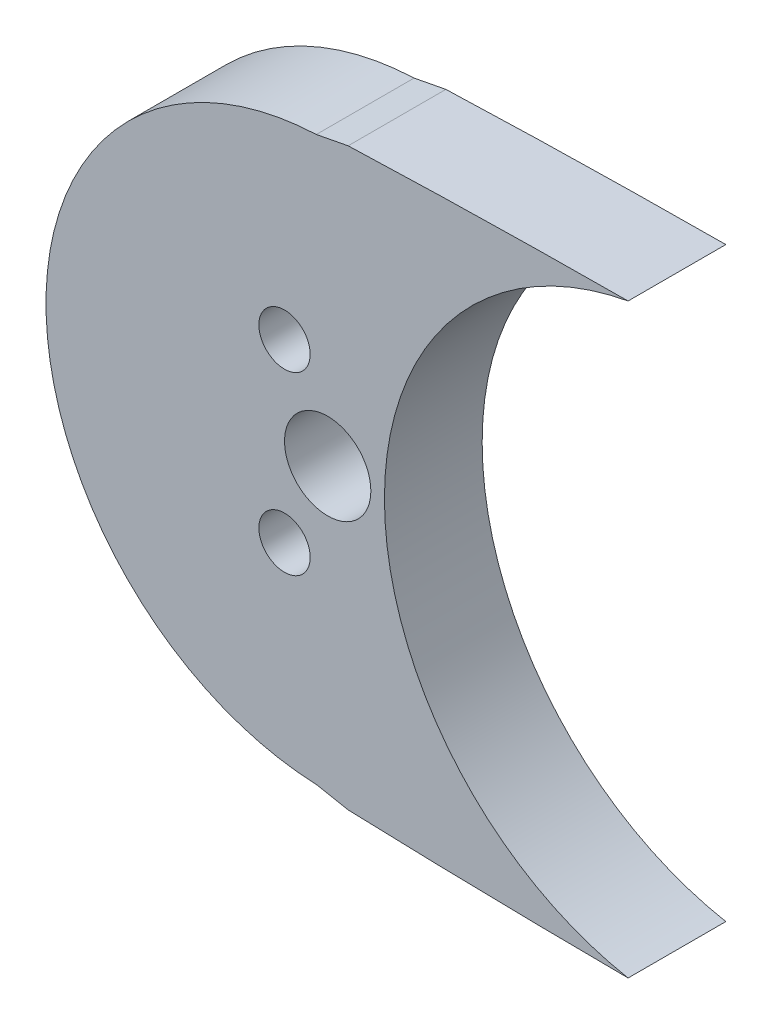
ISO-10303-21;
HEADER;
FILE_DESCRIPTION(('STEP AP214'),'2;1');
FILE_NAME('part.step','',(''),(''),'','','');
FILE_SCHEMA(('AUTOMOTIVE_DESIGN { 1 0 10303 214 1 1 1 1 }'));
ENDSEC;
DATA;
#1=APPLICATION_CONTEXT('core data for automotive mechanical design processes');
#2=APPLICATION_PROTOCOL_DEFINITION('international standard','automotive_design',2000,#1);
#3=PRODUCT_CONTEXT('',#1,'mechanical');
#4=PRODUCT('Part','Part','',(#3));
#5=PRODUCT_RELATED_PRODUCT_CATEGORY('part','',(#4));
#6=PRODUCT_DEFINITION_FORMATION('','',#4);
#7=PRODUCT_DEFINITION_CONTEXT('part definition',#1,'design');
#8=PRODUCT_DEFINITION('design','',#6,#7);
#9=PRODUCT_DEFINITION_SHAPE('','',#8);
#10=(LENGTH_UNIT() NAMED_UNIT(*) SI_UNIT(.MILLI.,.METRE.));
#11=(NAMED_UNIT(*) PLANE_ANGLE_UNIT() SI_UNIT($,.RADIAN.));
#12=(NAMED_UNIT(*) SI_UNIT($,.STERADIAN.) SOLID_ANGLE_UNIT());
#13=UNCERTAINTY_MEASURE_WITH_UNIT(LENGTH_MEASURE(1.E-05),#10,'distance_accuracy_value','');
#14=(GEOMETRIC_REPRESENTATION_CONTEXT(3) GLOBAL_UNCERTAINTY_ASSIGNED_CONTEXT((#13)) GLOBAL_UNIT_ASSIGNED_CONTEXT((#10,
#11,#12)) REPRESENTATION_CONTEXT('',''));
#15=CARTESIAN_POINT('',(0.,0.,0.));
#16=DIRECTION('',(0.,0.,1.));
#17=DIRECTION('',(1.,0.,0.));
#18=AXIS2_PLACEMENT_3D('',#15,#16,#17);
#19=CARTESIAN_POINT('',(300.,0.378,10.25));
#20=CARTESIAN_POINT('',(299.845901447221,0.39961034336831,10.25));
#21=CARTESIAN_POINT('',(299.230346714046,0.48593399083917,10.25));
#22=CARTESIAN_POINT('',(297.848901683276,0.678531057447331,10.25));
#23=CARTESIAN_POINT('',(295.556029122455,0.996787499241564,10.25));
#24=CARTESIAN_POINT('',(292.365739581197,1.43343203295321,10.25));
#25=CARTESIAN_POINT('',(288.297856433401,1.98344889126347,10.25));
#26=CARTESIAN_POINT('',(283.377248038078,2.63572648359042,10.25));
#27=CARTESIAN_POINT('',(277.63430498472,3.38149178862329,10.25));
#28=CARTESIAN_POINT('',(271.104515413466,4.20901604095742,10.25));
#29=CARTESIAN_POINT('',(263.828064626846,5.10718872872647,10.25));
#30=CARTESIAN_POINT('',(255.849823781818,6.06276893212352,10.25));
#31=CARTESIAN_POINT('',(247.21903434379,7.06424307195608,10.25));
#32=CARTESIAN_POINT('',(237.988783489903,8.09787318806774,10.25));
#33=CARTESIAN_POINT('',(228.216029511608,9.15107036010328,10.25));
#34=CARTESIAN_POINT('',(217.961088379031,10.2107446574668,10.25));
#35=CARTESIAN_POINT('',(207.287161839572,11.2632209265187,10.25));
#36=CARTESIAN_POINT('',(196.260086850424,12.2937248064858,10.25));
#37=CARTESIAN_POINT('',(184.947773044503,13.2887281219597,10.25));
#38=CARTESIAN_POINT('',(173.420088229148,14.2315961384787,10.25));
#39=CARTESIAN_POINT('',(161.747864995533,15.1069553720124,10.25));
#40=CARTESIAN_POINT('',(150.00317252135,15.8985540753976,10.25));
#41=CARTESIAN_POINT('',(138.258374542497,16.5898406039741,10.25));
#42=CARTESIAN_POINT('',(126.585774705795,17.1633504747405,10.25));
#43=CARTESIAN_POINT('',(115.057462615139,17.6037905135667,10.25));
#44=CARTESIAN_POINT('',(103.744181572864,17.8967919128621,10.25));
#45=CARTESIAN_POINT('',(92.7158453472272,18.0280433746414,10.25));
#46=CARTESIAN_POINT('',(82.0402185013839,17.9871287273908,10.25));
#47=CARTESIAN_POINT('',(71.7831190583338,17.7661449762132,10.25));
#48=CARTESIAN_POINT('',(62.0076841473254,17.3594904245971,10.25));
#49=CARTESIAN_POINT('',(52.7740834437817,16.7661013276277,10.25));
#50=CARTESIAN_POINT('',(44.1390669938569,15.987763153894,10.25));
#51=CARTESIAN_POINT('',(36.1554749512941,15.0305547578774,10.25));
#52=CARTESIAN_POINT('',(28.8719698679608,13.9026205663682,10.25));
#53=CARTESIAN_POINT('',(22.3326880228315,12.6157408879695,10.25));
#54=CARTESIAN_POINT('',(16.5759570466198,11.1844668147641,10.25));
#55=CARTESIAN_POINT('',(11.6344891822112,9.62275505380201,10.25));
#56=CARTESIAN_POINT('',(7.53339032845527,7.94515078115887,10.25));
#57=CARTESIAN_POINT('',(4.28573900369485,6.16300377839948,10.25));
#58=CARTESIAN_POINT('',(1.8965325692393,4.27279663699588,10.25));
#59=CARTESIAN_POINT('',(0.366265286449645,2.2288009510305,10.25));
#60=CARTESIAN_POINT('',(-0.170692645797294,0.,10.25));
#61=CARTESIAN_POINT('',(0.366265286449666,-2.22880095103055,10.25));
#62=CARTESIAN_POINT('',(1.89653256923925,-4.27279663699582,10.25));
#63=CARTESIAN_POINT('',(4.28573900369493,-6.16300377839955,10.25));
#64=CARTESIAN_POINT('',(7.53339032845521,-7.94515078115883,10.25));
#65=CARTESIAN_POINT('',(11.6344891822112,-9.62275505380201,10.25));
#66=CARTESIAN_POINT('',(16.5759570466199,-11.1844668147641,10.25));
#67=CARTESIAN_POINT('',(22.3326880228314,-12.6157408879695,10.25));
#68=CARTESIAN_POINT('',(28.8719698679608,-13.9026205663682,10.25));
#69=CARTESIAN_POINT('',(36.155474951294,-15.0305547578773,10.25));
#70=CARTESIAN_POINT('',(44.1390669938569,-15.987763153894,10.25));
#71=CARTESIAN_POINT('',(52.7740834437817,-16.7661013276277,10.25));
#72=CARTESIAN_POINT('',(62.0076841473254,-17.3594904245971,10.25));
#73=CARTESIAN_POINT('',(71.7831190583338,-17.7661449762132,10.25));
#74=CARTESIAN_POINT('',(82.0402185013839,-17.9871287273908,10.25));
#75=CARTESIAN_POINT('',(92.7158453472273,-18.0280433746414,10.25));
#76=CARTESIAN_POINT('',(103.744181572864,-17.8967919128621,10.25));
#77=CARTESIAN_POINT('',(115.057462615139,-17.6037905135667,10.25));
#78=CARTESIAN_POINT('',(126.585774705795,-17.1633504747405,10.25));
#79=CARTESIAN_POINT('',(138.258374542497,-16.5898406039741,10.25));
#80=CARTESIAN_POINT('',(150.00317252135,-15.8985540753976,10.25));
#81=CARTESIAN_POINT('',(161.747864995533,-15.1069553720124,10.25));
#82=CARTESIAN_POINT('',(173.420088229148,-14.2315961384787,10.25));
#83=CARTESIAN_POINT('',(184.947773044503,-13.2887281219597,10.25));
#84=CARTESIAN_POINT('',(196.260086850424,-12.2937248064858,10.25));
#85=CARTESIAN_POINT('',(207.287161839572,-11.2632209265187,10.25));
#86=CARTESIAN_POINT('',(217.961088379031,-10.2107446574668,10.25));
#87=CARTESIAN_POINT('',(228.216029511608,-9.15107036010328,10.25));
#88=CARTESIAN_POINT('',(237.988783489903,-8.09787318806774,10.25));
#89=CARTESIAN_POINT('',(247.21903434379,-7.06424307195608,10.25));
#90=CARTESIAN_POINT('',(255.849823781818,-6.0627689321235,10.25));
#91=CARTESIAN_POINT('',(263.828064626846,-5.10718872872648,10.25));
#92=CARTESIAN_POINT('',(271.104515413466,-4.20901604095741,10.25));
#93=CARTESIAN_POINT('',(277.63430498472,-3.38149178862329,10.25));
#94=CARTESIAN_POINT('',(283.377248038078,-2.63572648359043,10.25));
#95=CARTESIAN_POINT('',(288.297856433401,-1.98344889126346,10.25));
#96=CARTESIAN_POINT('',(292.365739581198,-1.43343203295321,10.25));
#97=CARTESIAN_POINT('',(295.556029122455,-0.996787499241567,10.25));
#98=CARTESIAN_POINT('',(297.848901683276,-0.678531057447318,10.25));
#99=CARTESIAN_POINT('',(299.230346714046,-0.48593399083919,10.25));
#100=CARTESIAN_POINT('',(299.845901447221,-0.399610343368311,10.25));
#101=CARTESIAN_POINT('',(300.,-0.378,10.25));
#102=B_SPLINE_CURVE_WITH_KNOTS('',3,(#19,#20,#21,#22,#23,#24,#25,#26,#27,#28,#29,#30,#31,#32,
#33,#34,#35,#36,#37,#38,#39,#40,#41,#42,#43,#44,#45,#46,#47,#48,#49,#50,#51,#52,#53,#54,#55,#56,
#57,#58,#59,#60,#61,#62,#63,#64,#65,#66,#67,#68,#69,#70,#71,#72,#73,#74,#75,#76,#77,#78,#79,#80,
#81,#82,#83,#84,#85,#86,#87,#88,#89,#90,#91,#92,#93,#94,#95,#96,#97,#98,#99,#100,#101),
.UNSPECIFIED.,.F.,.F.,(4,1,1,1,1,1,1,1,1,1,1,1,1,1,1,1,1,1,1,1,1,1,1,1,1,1,1,1,1,1,1,1,1,1,1,1,
1,1,1,1,1,1,1,1,1,1,1,1,1,1,1,1,1,1,1,1,1,1,1,1,1,1,1,1,1,1,1,1,1,1,1,1,1,1,1,1,1,1,1,1,4),(0.,
0.000763156679271448,0.00304846929193477,0.00684068957953669,0.0121161317605396,
0.0188407924276644,0.0269727495182071,0.0364598537113803,0.0472429445210447,0.0592535547279477,
0.0724172643119224,0.0866510217067198,0.101866322474926,0.117968955401192,0.134857918638583,
0.152428309483259,0.170571841082248,0.189174521814913,0.208122338288737,0.227296649324545,
0.246580070424687,0.265853108019993,0.284996761496293,0.303895241632262,0.322432580929281,
0.340498658943124,0.357984483489282,0.37478811429809,0.390812303248415,0.405965006366899,
0.420162443159487,0.433328264782086,0.445393603392471,0.456301171479378,0.466003880875037,
0.474472000637231,0.481696232103684,0.487703697963338,0.492583405321472,0.496543603187854,0.5,
0.503456396812145,0.507416594678528,0.512296302036662,0.518303767896316,0.525527999362769,
0.533996119124963,0.543698828520622,0.554606396607529,0.566671735217914,0.579837556840513,
0.594034993633101,0.609187696751585,0.62521188570191,0.642015516510718,0.659501341056876,
0.677567419070719,0.696104758367738,0.715003238503707,0.734146891980006,0.753419929575313,
0.772703350675454,0.791877661711263,0.810825478185087,0.829428158917752,0.847571690516741,
0.865142081361417,0.882031044598807,0.898133677525074,0.91334897829328,0.927582735688077,
0.940746445272052,0.952757055478955,0.96354014628862,0.973027250481793,0.981159207572336,
0.98788386823946,0.993159310420463,0.996951530708065,0.999236843320729,1.),.UNSPECIFIED.);
#103=DIRECTION('',(0.,0.,-1.));
#104=VECTOR('',#103,1.);
#105=SURFACE_OF_LINEAR_EXTRUSION('',#102,#104);
#106=CARTESIAN_POINT('',(300.,0.378,4.25));
#107=CARTESIAN_POINT('',(299.845901447221,0.39961034336831,4.25));
#108=CARTESIAN_POINT('',(299.230346714046,0.48593399083917,4.25));
#109=CARTESIAN_POINT('',(297.848901683276,0.678531057447331,4.25));
#110=CARTESIAN_POINT('',(295.556029122455,0.996787499241564,4.25));
#111=CARTESIAN_POINT('',(292.365739581197,1.43343203295321,4.25));
#112=CARTESIAN_POINT('',(288.297856433401,1.98344889126347,4.25));
#113=CARTESIAN_POINT('',(283.377248038078,2.63572648359042,4.25));
#114=CARTESIAN_POINT('',(277.63430498472,3.38149178862329,4.25));
#115=CARTESIAN_POINT('',(271.104515413466,4.20901604095742,4.25));
#116=CARTESIAN_POINT('',(263.828064626846,5.10718872872647,4.25));
#117=CARTESIAN_POINT('',(255.849823781818,6.06276893212352,4.25));
#118=CARTESIAN_POINT('',(247.21903434379,7.06424307195608,4.25));
#119=CARTESIAN_POINT('',(237.988783489903,8.09787318806774,4.25));
#120=CARTESIAN_POINT('',(228.216029511608,9.15107036010328,4.25));
#121=CARTESIAN_POINT('',(217.961088379031,10.2107446574668,4.25));
#122=CARTESIAN_POINT('',(207.287161839572,11.2632209265187,4.25));
#123=CARTESIAN_POINT('',(196.260086850424,12.2937248064858,4.25));
#124=CARTESIAN_POINT('',(184.947773044503,13.2887281219597,4.25));
#125=CARTESIAN_POINT('',(173.420088229148,14.2315961384787,4.25));
#126=CARTESIAN_POINT('',(161.747864995533,15.1069553720124,4.25));
#127=CARTESIAN_POINT('',(150.00317252135,15.8985540753976,4.25));
#128=CARTESIAN_POINT('',(138.258374542497,16.5898406039741,4.25));
#129=CARTESIAN_POINT('',(126.585774705795,17.1633504747405,4.25));
#130=CARTESIAN_POINT('',(115.057462615139,17.6037905135667,4.25));
#131=CARTESIAN_POINT('',(103.744181572864,17.8967919128621,4.25));
#132=CARTESIAN_POINT('',(92.7158453472272,18.0280433746414,4.25));
#133=CARTESIAN_POINT('',(82.0402185013839,17.9871287273908,4.25));
#134=CARTESIAN_POINT('',(71.7831190583338,17.7661449762132,4.25));
#135=CARTESIAN_POINT('',(62.0076841473254,17.3594904245971,4.25));
#136=CARTESIAN_POINT('',(52.7740834437817,16.7661013276277,4.25));
#137=CARTESIAN_POINT('',(44.1390669938569,15.987763153894,4.25));
#138=CARTESIAN_POINT('',(36.1554749512941,15.0305547578774,4.25));
#139=CARTESIAN_POINT('',(28.8719698679608,13.9026205663682,4.25));
#140=CARTESIAN_POINT('',(22.3326880228315,12.6157408879695,4.25));
#141=CARTESIAN_POINT('',(16.5759570466198,11.1844668147641,4.25));
#142=CARTESIAN_POINT('',(11.6344891822112,9.62275505380201,4.25));
#143=CARTESIAN_POINT('',(7.53339032845527,7.94515078115887,4.25));
#144=CARTESIAN_POINT('',(4.28573900369485,6.16300377839948,4.25));
#145=CARTESIAN_POINT('',(1.8965325692393,4.27279663699588,4.25));
#146=CARTESIAN_POINT('',(0.366265286449645,2.2288009510305,4.25));
#147=CARTESIAN_POINT('',(-0.170692645797294,0.,4.25));
#148=CARTESIAN_POINT('',(0.366265286449666,-2.22880095103055,4.25));
#149=CARTESIAN_POINT('',(1.89653256923925,-4.27279663699582,4.25));
#150=CARTESIAN_POINT('',(4.28573900369493,-6.16300377839955,4.25));
#151=CARTESIAN_POINT('',(7.53339032845521,-7.94515078115883,4.25));
#152=CARTESIAN_POINT('',(11.6344891822112,-9.62275505380201,4.25));
#153=CARTESIAN_POINT('',(16.5759570466199,-11.1844668147641,4.25));
#154=CARTESIAN_POINT('',(22.3326880228314,-12.6157408879695,4.25));
#155=CARTESIAN_POINT('',(28.8719698679608,-13.9026205663682,4.25));
#156=CARTESIAN_POINT('',(36.155474951294,-15.0305547578773,4.25));
#157=CARTESIAN_POINT('',(44.1390669938569,-15.987763153894,4.25));
#158=CARTESIAN_POINT('',(52.7740834437817,-16.7661013276277,4.25));
#159=CARTESIAN_POINT('',(62.0076841473254,-17.3594904245971,4.25));
#160=CARTESIAN_POINT('',(71.7831190583338,-17.7661449762132,4.25));
#161=CARTESIAN_POINT('',(82.0402185013839,-17.9871287273908,4.25));
#162=CARTESIAN_POINT('',(92.7158453472273,-18.0280433746414,4.25));
#163=CARTESIAN_POINT('',(103.744181572864,-17.8967919128621,4.25));
#164=CARTESIAN_POINT('',(115.057462615139,-17.6037905135667,4.25));
#165=CARTESIAN_POINT('',(126.585774705795,-17.1633504747405,4.25));
#166=CARTESIAN_POINT('',(138.258374542497,-16.5898406039741,4.25));
#167=CARTESIAN_POINT('',(150.00317252135,-15.8985540753976,4.25));
#168=CARTESIAN_POINT('',(161.747864995533,-15.1069553720124,4.25));
#169=CARTESIAN_POINT('',(173.420088229148,-14.2315961384787,4.25));
#170=CARTESIAN_POINT('',(184.947773044503,-13.2887281219597,4.25));
#171=CARTESIAN_POINT('',(196.260086850424,-12.2937248064858,4.25));
#172=CARTESIAN_POINT('',(207.287161839572,-11.2632209265187,4.25));
#173=CARTESIAN_POINT('',(217.961088379031,-10.2107446574668,4.25));
#174=CARTESIAN_POINT('',(228.216029511608,-9.15107036010328,4.25));
#175=CARTESIAN_POINT('',(237.988783489903,-8.09787318806774,4.25));
#176=CARTESIAN_POINT('',(247.21903434379,-7.06424307195608,4.25));
#177=CARTESIAN_POINT('',(255.849823781818,-6.0627689321235,4.25));
#178=CARTESIAN_POINT('',(263.828064626846,-5.10718872872648,4.25));
#179=CARTESIAN_POINT('',(271.104515413466,-4.20901604095741,4.25));
#180=CARTESIAN_POINT('',(277.63430498472,-3.38149178862329,4.25));
#181=CARTESIAN_POINT('',(283.377248038078,-2.63572648359043,4.25));
#182=CARTESIAN_POINT('',(288.297856433401,-1.98344889126346,4.25));
#183=CARTESIAN_POINT('',(292.365739581198,-1.43343203295321,4.25));
#184=CARTESIAN_POINT('',(295.556029122455,-0.996787499241567,4.25));
#185=CARTESIAN_POINT('',(297.848901683276,-0.678531057447318,4.25));
#186=CARTESIAN_POINT('',(299.230346714046,-0.48593399083919,4.25));
#187=CARTESIAN_POINT('',(299.845901447221,-0.399610343368311,4.25));
#188=CARTESIAN_POINT('',(300.,-0.378,4.25));
#189=B_SPLINE_CURVE_WITH_KNOTS('',3,(#106,#107,#108,#109,#110,#111,#112,#113,#114,#115,#116,
#117,#118,#119,#120,#121,#122,#123,#124,#125,#126,#127,#128,#129,#130,#131,#132,#133,#134,#135,
#136,#137,#138,#139,#140,#141,#142,#143,#144,#145,#146,#147,#148,#149,#150,#151,#152,#153,#154,
#155,#156,#157,#158,#159,#160,#161,#162,#163,#164,#165,#166,#167,#168,#169,#170,#171,#172,#173,
#174,#175,#176,#177,#178,#179,#180,#181,#182,#183,#184,#185,#186,#187,#188),.UNSPECIFIED.,.F.,
.F.,(4,1,1,1,1,1,1,1,1,1,1,1,1,1,1,1,1,1,1,1,1,1,1,1,1,1,1,1,1,1,1,1,1,1,1,1,1,1,1,1,1,1,1,1,1,
1,1,1,1,1,1,1,1,1,1,1,1,1,1,1,1,1,1,1,1,1,1,1,1,1,1,1,1,1,1,1,1,1,1,1,4),(0.,
0.000763156679271448,0.00304846929193477,0.00684068957953669,0.0121161317605396,
0.0188407924276644,0.0269727495182071,0.0364598537113803,0.0472429445210447,0.0592535547279477,
0.0724172643119224,0.0866510217067198,0.101866322474926,0.117968955401192,0.134857918638583,
0.152428309483259,0.170571841082248,0.189174521814913,0.208122338288737,0.227296649324545,
0.246580070424687,0.265853108019993,0.284996761496293,0.303895241632262,0.322432580929281,
0.340498658943124,0.357984483489282,0.37478811429809,0.390812303248415,0.405965006366899,
0.420162443159487,0.433328264782086,0.445393603392471,0.456301171479378,0.466003880875037,
0.474472000637231,0.481696232103684,0.487703697963338,0.492583405321472,0.496543603187854,0.5,
0.503456396812145,0.507416594678528,0.512296302036662,0.518303767896316,0.525527999362769,
0.533996119124963,0.543698828520622,0.554606396607529,0.566671735217914,0.579837556840513,
0.594034993633101,0.609187696751585,0.62521188570191,0.642015516510718,0.659501341056876,
0.677567419070719,0.696104758367738,0.715003238503707,0.734146891980006,0.753419929575313,
0.772703350675454,0.791877661711263,0.810825478185087,0.829428158917752,0.847571690516741,
0.865142081361417,0.882031044598807,0.898133677525074,0.91334897829328,0.927582735688077,
0.940746445272052,0.952757055478955,0.96354014628862,0.973027250481793,0.981159207572336,
0.98788386823946,0.993159310420463,0.996951530708065,0.999236843320729,1.),.UNSPECIFIED.);
#190=CARTESIAN_POINT('',(69.4665420011252,-17.6542147685064,4.25));
#191=VERTEX_POINT('',#190);
#192=CARTESIAN_POINT('',(86.6530915230846,-17.9968622462722,4.25));
#193=VERTEX_POINT('',#192);
#194=EDGE_CURVE('E183',#191,#193,#189,.T.);
#195=ORIENTED_EDGE('',*,*,#194,.T.);
#196=DIRECTION('',(0.,0.,1.));
#197=VECTOR('',#196,1.);
#198=CARTESIAN_POINT('',(86.6530915230846,-17.9968622462722,4.25));
#199=LINE('',#198,#197);
#200=CARTESIAN_POINT('',(86.6530915230846,-17.9968622462722,10.25));
#201=VERTEX_POINT('',#200);
#202=EDGE_CURVE('E62',#193,#201,#199,.T.);
#203=ORIENTED_EDGE('',*,*,#202,.T.);
#204=CARTESIAN_POINT('',(69.4665420011252,-17.6542147685064,10.25));
#205=VERTEX_POINT('',#204);
#206=EDGE_CURVE('E118',#205,#201,#102,.T.);
#207=ORIENTED_EDGE('',*,*,#206,.F.);
#208=DIRECTION('',(0.,0.,1.));
#209=VECTOR('',#208,1.);
#210=CARTESIAN_POINT('',(69.4665420011252,-17.6542147685064,4.25));
#211=LINE('',#210,#209);
#212=EDGE_CURVE('E184',#191,#205,#211,.T.);
#213=ORIENTED_EDGE('',*,*,#212,.F.);
#214=EDGE_LOOP('',(#195,#203,#207,#213));
#215=FACE_BOUND('',#214,.T.);
#216=ADVANCED_FACE('F44',(#215),#105,.F.);
#217=CARTESIAN_POINT('',(0.,0.,10.25));
#218=DIRECTION('',(0.,0.,1.));
#219=DIRECTION('',(1.,0.,0.));
#220=AXIS2_PLACEMENT_3D('',#217,#218,#219);
#221=PLANE('',#220);
#222=CARTESIAN_POINT('',(65.5598517870718,5.4,10.25));
#223=DIRECTION('',(0.,0.,1.));
#224=DIRECTION('',(1.,0.,0.));
#225=AXIS2_PLACEMENT_3D('',#222,#223,#224);
#226=CIRCLE('',#225,1.57500000000001);
#227=CARTESIAN_POINT('',(67.1348517870718,5.4,10.25));
#228=VERTEX_POINT('',#227);
#229=EDGE_CURVE('E209',#228,#228,#226,.T.);
#230=ORIENTED_EDGE('',*,*,#229,.F.);
#231=EDGE_LOOP('',(#230));
#232=FACE_BOUND('',#231,.T.);
#233=CARTESIAN_POINT('',(65.5598517870718,-5.4,10.25));
#234=DIRECTION('',(0.,0.,1.));
#235=DIRECTION('',(1.,0.,0.));
#236=AXIS2_PLACEMENT_3D('',#233,#234,#235);
#237=CIRCLE('',#236,1.57500000000001);
#238=CARTESIAN_POINT('',(67.1348517870718,-5.4,10.25));
#239=VERTEX_POINT('',#238);
#240=EDGE_CURVE('E216',#239,#239,#237,.T.);
#241=ORIENTED_EDGE('',*,*,#240,.F.);
#242=EDGE_LOOP('',(#241));
#243=FACE_BOUND('',#242,.T.);
#244=CARTESIAN_POINT('',(89.9987178851088,0.,10.25));
#245=DIRECTION('',(0.,0.,1.));
#246=DIRECTION('',(1.,0.,0.));
#247=AXIS2_PLACEMENT_3D('',#244,#245,#246);
#248=CIRCLE('',#247,18.3051977991381);
#249=CARTESIAN_POINT('',(86.6530915230852,17.9968622462722,10.25));
#250=VERTEX_POINT('',#249);
#251=EDGE_CURVE('E102',#250,#201,#248,.T.);
#252=ORIENTED_EDGE('',*,*,#251,.F.);
#253=CARTESIAN_POINT('',(300.,0.378,10.25));
#254=CARTESIAN_POINT('',(299.845901447221,0.39961034336831,10.25));
#255=CARTESIAN_POINT('',(299.230346714046,0.48593399083917,10.25));
#256=CARTESIAN_POINT('',(297.848901683276,0.678531057447331,10.25));
#257=CARTESIAN_POINT('',(295.556029122455,0.996787499241564,10.25));
#258=CARTESIAN_POINT('',(292.365739581197,1.43343203295321,10.25));
#259=CARTESIAN_POINT('',(288.297856433401,1.98344889126347,10.25));
#260=CARTESIAN_POINT('',(283.377248038078,2.63572648359042,10.25));
#261=CARTESIAN_POINT('',(277.63430498472,3.38149178862329,10.25));
#262=CARTESIAN_POINT('',(271.104515413466,4.20901604095742,10.25));
#263=CARTESIAN_POINT('',(263.828064626846,5.10718872872647,10.25));
#264=CARTESIAN_POINT('',(255.849823781818,6.06276893212352,10.25));
#265=CARTESIAN_POINT('',(247.21903434379,7.06424307195608,10.25));
#266=CARTESIAN_POINT('',(237.988783489903,8.09787318806774,10.25));
#267=CARTESIAN_POINT('',(228.216029511608,9.15107036010328,10.25));
#268=CARTESIAN_POINT('',(217.961088379031,10.2107446574668,10.25));
#269=CARTESIAN_POINT('',(207.287161839572,11.2632209265187,10.25));
#270=CARTESIAN_POINT('',(196.260086850424,12.2937248064858,10.25));
#271=CARTESIAN_POINT('',(184.947773044503,13.2887281219597,10.25));
#272=CARTESIAN_POINT('',(173.420088229148,14.2315961384787,10.25));
#273=CARTESIAN_POINT('',(161.747864995533,15.1069553720124,10.25));
#274=CARTESIAN_POINT('',(150.00317252135,15.8985540753976,10.25));
#275=CARTESIAN_POINT('',(138.258374542497,16.5898406039741,10.25));
#276=CARTESIAN_POINT('',(126.585774705795,17.1633504747405,10.25));
#277=CARTESIAN_POINT('',(115.057462615139,17.6037905135667,10.25));
#278=CARTESIAN_POINT('',(103.744181572864,17.8967919128621,10.25));
#279=CARTESIAN_POINT('',(92.7158453472272,18.0280433746414,10.25));
#280=CARTESIAN_POINT('',(82.0402185013839,17.9871287273908,10.25));
#281=CARTESIAN_POINT('',(71.7831190583338,17.7661449762132,10.25));
#282=CARTESIAN_POINT('',(62.0076841473254,17.3594904245971,10.25));
#283=CARTESIAN_POINT('',(52.7740834437817,16.7661013276277,10.25));
#284=CARTESIAN_POINT('',(44.1390669938569,15.987763153894,10.25));
#285=CARTESIAN_POINT('',(36.1554749512941,15.0305547578774,10.25));
#286=CARTESIAN_POINT('',(28.8719698679608,13.9026205663682,10.25));
#287=CARTESIAN_POINT('',(22.3326880228315,12.6157408879695,10.25));
#288=CARTESIAN_POINT('',(16.5759570466198,11.1844668147641,10.25));
#289=CARTESIAN_POINT('',(11.6344891822112,9.62275505380201,10.25));
#290=CARTESIAN_POINT('',(7.53339032845527,7.94515078115887,10.25));
#291=CARTESIAN_POINT('',(4.28573900369485,6.16300377839948,10.25));
#292=CARTESIAN_POINT('',(1.8965325692393,4.27279663699588,10.25));
#293=CARTESIAN_POINT('',(0.366265286449645,2.2288009510305,10.25));
#294=CARTESIAN_POINT('',(-0.170692645797294,0.,10.25));
#295=CARTESIAN_POINT('',(0.366265286449666,-2.22880095103055,10.25));
#296=CARTESIAN_POINT('',(1.89653256923925,-4.27279663699582,10.25));
#297=CARTESIAN_POINT('',(4.28573900369493,-6.16300377839955,10.25));
#298=CARTESIAN_POINT('',(7.53339032845521,-7.94515078115883,10.25));
#299=CARTESIAN_POINT('',(11.6344891822112,-9.62275505380201,10.25));
#300=CARTESIAN_POINT('',(16.5759570466199,-11.1844668147641,10.25));
#301=CARTESIAN_POINT('',(22.3326880228314,-12.6157408879695,10.25));
#302=CARTESIAN_POINT('',(28.8719698679608,-13.9026205663682,10.25));
#303=CARTESIAN_POINT('',(36.155474951294,-15.0305547578773,10.25));
#304=CARTESIAN_POINT('',(44.1390669938569,-15.987763153894,10.25));
#305=CARTESIAN_POINT('',(52.7740834437817,-16.7661013276277,10.25));
#306=CARTESIAN_POINT('',(62.0076841473254,-17.3594904245971,10.25));
#307=CARTESIAN_POINT('',(71.7831190583338,-17.7661449762132,10.25));
#308=CARTESIAN_POINT('',(82.0402185013839,-17.9871287273908,10.25));
#309=CARTESIAN_POINT('',(92.7158453472273,-18.0280433746414,10.25));
#310=CARTESIAN_POINT('',(103.744181572864,-17.8967919128621,10.25));
#311=CARTESIAN_POINT('',(115.057462615139,-17.6037905135667,10.25));
#312=CARTESIAN_POINT('',(126.585774705795,-17.1633504747405,10.25));
#313=CARTESIAN_POINT('',(138.258374542497,-16.5898406039741,10.25));
#314=CARTESIAN_POINT('',(150.00317252135,-15.8985540753976,10.25));
#315=CARTESIAN_POINT('',(161.747864995533,-15.1069553720124,10.25));
#316=CARTESIAN_POINT('',(173.420088229148,-14.2315961384787,10.25));
#317=CARTESIAN_POINT('',(184.947773044503,-13.2887281219597,10.25));
#318=CARTESIAN_POINT('',(196.260086850424,-12.2937248064858,10.25));
#319=CARTESIAN_POINT('',(207.287161839572,-11.2632209265187,10.25));
#320=CARTESIAN_POINT('',(217.961088379031,-10.2107446574668,10.25));
#321=CARTESIAN_POINT('',(228.216029511608,-9.15107036010328,10.25));
#322=CARTESIAN_POINT('',(237.988783489903,-8.09787318806774,10.25));
#323=CARTESIAN_POINT('',(247.21903434379,-7.06424307195608,10.25));
#324=CARTESIAN_POINT('',(255.849823781818,-6.0627689321235,10.25));
#325=CARTESIAN_POINT('',(263.828064626846,-5.10718872872648,10.25));
#326=CARTESIAN_POINT('',(271.104515413466,-4.20901604095741,10.25));
#327=CARTESIAN_POINT('',(277.63430498472,-3.38149178862329,10.25));
#328=CARTESIAN_POINT('',(283.377248038078,-2.63572648359043,10.25));
#329=CARTESIAN_POINT('',(288.297856433401,-1.98344889126346,10.25));
#330=CARTESIAN_POINT('',(292.365739581198,-1.43343203295321,10.25));
#331=CARTESIAN_POINT('',(295.556029122455,-0.996787499241567,10.25));
#332=CARTESIAN_POINT('',(297.848901683276,-0.678531057447318,10.25));
#333=CARTESIAN_POINT('',(299.230346714046,-0.48593399083919,10.25));
#334=CARTESIAN_POINT('',(299.845901447221,-0.399610343368311,10.25));
#335=CARTESIAN_POINT('',(300.,-0.378,10.25));
#336=B_SPLINE_CURVE_WITH_KNOTS('',3,(#253,#254,#255,#256,#257,#258,#259,#260,#261,#262,#263,
#264,#265,#266,#267,#268,#269,#270,#271,#272,#273,#274,#275,#276,#277,#278,#279,#280,#281,#282,
#283,#284,#285,#286,#287,#288,#289,#290,#291,#292,#293,#294,#295,#296,#297,#298,#299,#300,#301,
#302,#303,#304,#305,#306,#307,#308,#309,#310,#311,#312,#313,#314,#315,#316,#317,#318,#319,#320,
#321,#322,#323,#324,#325,#326,#327,#328,#329,#330,#331,#332,#333,#334,#335),.UNSPECIFIED.,.F.,
.F.,(4,1,1,1,1,1,1,1,1,1,1,1,1,1,1,1,1,1,1,1,1,1,1,1,1,1,1,1,1,1,1,1,1,1,1,1,1,1,1,1,1,1,1,1,1,
1,1,1,1,1,1,1,1,1,1,1,1,1,1,1,1,1,1,1,1,1,1,1,1,1,1,1,1,1,1,1,1,1,1,1,4),(0.,
0.000763156679271448,0.00304846929193477,0.00684068957953669,0.0121161317605396,
0.0188407924276644,0.0269727495182071,0.0364598537113803,0.0472429445210447,0.0592535547279477,
0.0724172643119224,0.0866510217067198,0.101866322474926,0.117968955401192,0.134857918638583,
0.152428309483259,0.170571841082248,0.189174521814913,0.208122338288737,0.227296649324545,
0.246580070424687,0.265853108019993,0.284996761496293,0.303895241632262,0.322432580929281,
0.340498658943124,0.357984483489282,0.37478811429809,0.390812303248415,0.405965006366899,
0.420162443159487,0.433328264782086,0.445393603392471,0.456301171479378,0.466003880875037,
0.474472000637231,0.481696232103684,0.487703697963338,0.492583405321472,0.496543603187854,0.5,
0.503456396812145,0.507416594678528,0.512296302036662,0.518303767896316,0.525527999362769,
0.533996119124963,0.543698828520622,0.554606396607529,0.566671735217914,0.579837556840513,
0.594034993633101,0.609187696751585,0.62521188570191,0.642015516510718,0.659501341056876,
0.677567419070719,0.696104758367738,0.715003238503707,0.734146891980006,0.753419929575313,
0.772703350675454,0.791877661711263,0.810825478185087,0.829428158917752,0.847571690516741,
0.865142081361417,0.882031044598807,0.898133677525074,0.91334897829328,0.927582735688077,
0.940746445272052,0.952757055478955,0.96354014628862,0.973027250481793,0.981159207572336,
0.98788386823946,0.993159310420463,0.996951530708065,0.999236843320729,1.),.UNSPECIFIED.);
#337=CARTESIAN_POINT('',(69.4665420011249,17.6542147685064,10.25));
#338=VERTEX_POINT('',#337);
#339=EDGE_CURVE('E54',#250,#338,#336,.T.);
#340=ORIENTED_EDGE('',*,*,#339,.T.);
#341=DIRECTION('',(0.982081978553021,0.188454205050944,0.));
#342=VECTOR('',#341,1.);
#343=CARTESIAN_POINT('',(-0.800294191084981,4.17053311382872,10.25));
#344=LINE('',#343,#342);
#345=CARTESIAN_POINT('',(67.5121043853475,17.2791727691584,10.25));
#346=VERTEX_POINT('',#345);
#347=EDGE_CURVE('E239',#346,#338,#344,.T.);
#348=ORIENTED_EDGE('',*,*,#347,.F.);
#349=CARTESIAN_POINT('',(68.2098517870718,0.,10.25));
#350=DIRECTION('',(0.,0.,1.));
#351=DIRECTION('',(1.,0.,0.));
#352=AXIS2_PLACEMENT_3D('',#349,#350,#351);
#353=CIRCLE('',#352,17.2932548417885);
#354=CARTESIAN_POINT('',(67.5121043853475,-17.2791727691585,10.25));
#355=VERTEX_POINT('',#354);
#356=EDGE_CURVE('E215',#346,#355,#353,.T.);
#357=ORIENTED_EDGE('',*,*,#356,.T.);
#358=DIRECTION('',(0.982081978553029,-0.188454205050902,0.));
#359=VECTOR('',#358,1.);
#360=CARTESIAN_POINT('',(-0.800294191085371,-4.17053311383171,10.25));
#361=LINE('',#360,#359);
#362=EDGE_CURVE('E229',#355,#205,#361,.T.);
#363=ORIENTED_EDGE('',*,*,#362,.T.);
#364=ORIENTED_EDGE('',*,*,#206,.T.);
#365=EDGE_LOOP('',(#252,#340,#348,#357,#363,#364));
#366=FACE_BOUND('',#365,.T.);
#367=CARTESIAN_POINT('',(68.2098517870718,0.,10.25));
#368=DIRECTION('',(0.,0.,1.));
#369=DIRECTION('',(1.,0.,0.));
#370=AXIS2_PLACEMENT_3D('',#367,#368,#369);
#371=CIRCLE('',#370,2.65);
#372=CARTESIAN_POINT('',(70.8598517870718,0.,10.25));
#373=VERTEX_POINT('',#372);
#374=EDGE_CURVE('E11',#373,#373,#371,.T.);
#375=ORIENTED_EDGE('',*,*,#374,.F.);
#376=EDGE_LOOP('',(#375));
#377=FACE_BOUND('',#376,.T.);
#378=ADVANCED_FACE('F113',(#232,#243,#366,#377),#221,.T.);
#379=CARTESIAN_POINT('',(0.,0.,4.25));
#380=DIRECTION('',(0.,0.,1.));
#381=DIRECTION('',(1.,0.,0.));
#382=AXIS2_PLACEMENT_3D('',#379,#380,#381);
#383=PLANE('',#382);
#384=CARTESIAN_POINT('',(65.5598517870718,5.4,4.25));
#385=DIRECTION('',(0.,0.,1.));
#386=DIRECTION('',(1.,0.,0.));
#387=AXIS2_PLACEMENT_3D('',#384,#385,#386);
#388=CIRCLE('',#387,1.57500000000001);
#389=CARTESIAN_POINT('',(67.1348517870718,5.4,4.25));
#390=VERTEX_POINT('',#389);
#391=EDGE_CURVE('E48',#390,#390,#388,.T.);
#392=ORIENTED_EDGE('',*,*,#391,.T.);
#393=EDGE_LOOP('',(#392));
#394=FACE_BOUND('',#393,.T.);
#395=CARTESIAN_POINT('',(65.5598517870718,-5.4,4.25));
#396=DIRECTION('',(0.,0.,1.));
#397=DIRECTION('',(1.,0.,0.));
#398=AXIS2_PLACEMENT_3D('',#395,#396,#397);
#399=CIRCLE('',#398,1.57500000000001);
#400=CARTESIAN_POINT('',(67.1348517870718,-5.4,4.25));
#401=VERTEX_POINT('',#400);
#402=EDGE_CURVE('E206',#401,#401,#399,.T.);
#403=ORIENTED_EDGE('',*,*,#402,.T.);
#404=EDGE_LOOP('',(#403));
#405=FACE_BOUND('',#404,.T.);
#406=CARTESIAN_POINT('',(68.2098517870718,0.,4.25));
#407=DIRECTION('',(0.,0.,1.));
#408=DIRECTION('',(1.,0.,0.));
#409=AXIS2_PLACEMENT_3D('',#406,#407,#408);
#410=CIRCLE('',#409,2.65);
#411=CARTESIAN_POINT('',(70.8598517870718,0.,4.25));
#412=VERTEX_POINT('',#411);
#413=EDGE_CURVE('E126',#412,#412,#410,.T.);
#414=ORIENTED_EDGE('',*,*,#413,.T.);
#415=EDGE_LOOP('',(#414));
#416=FACE_BOUND('',#415,.T.);
#417=CARTESIAN_POINT('',(300.,0.378,4.25));
#418=CARTESIAN_POINT('',(299.845901447221,0.39961034336831,4.25));
#419=CARTESIAN_POINT('',(299.230346714046,0.48593399083917,4.25));
#420=CARTESIAN_POINT('',(297.848901683276,0.678531057447331,4.25));
#421=CARTESIAN_POINT('',(295.556029122455,0.996787499241564,4.25));
#422=CARTESIAN_POINT('',(292.365739581197,1.43343203295321,4.25));
#423=CARTESIAN_POINT('',(288.297856433401,1.98344889126347,4.25));
#424=CARTESIAN_POINT('',(283.377248038078,2.63572648359042,4.25));
#425=CARTESIAN_POINT('',(277.63430498472,3.38149178862329,4.25));
#426=CARTESIAN_POINT('',(271.104515413466,4.20901604095742,4.25));
#427=CARTESIAN_POINT('',(263.828064626846,5.10718872872647,4.25));
#428=CARTESIAN_POINT('',(255.849823781818,6.06276893212352,4.25));
#429=CARTESIAN_POINT('',(247.21903434379,7.06424307195608,4.25));
#430=CARTESIAN_POINT('',(237.988783489903,8.09787318806774,4.25));
#431=CARTESIAN_POINT('',(228.216029511608,9.15107036010328,4.25));
#432=CARTESIAN_POINT('',(217.961088379031,10.2107446574668,4.25));
#433=CARTESIAN_POINT('',(207.287161839572,11.2632209265187,4.25));
#434=CARTESIAN_POINT('',(196.260086850424,12.2937248064858,4.25));
#435=CARTESIAN_POINT('',(184.947773044503,13.2887281219597,4.25));
#436=CARTESIAN_POINT('',(173.420088229148,14.2315961384787,4.25));
#437=CARTESIAN_POINT('',(161.747864995533,15.1069553720124,4.25));
#438=CARTESIAN_POINT('',(150.00317252135,15.8985540753976,4.25));
#439=CARTESIAN_POINT('',(138.258374542497,16.5898406039741,4.25));
#440=CARTESIAN_POINT('',(126.585774705795,17.1633504747405,4.25));
#441=CARTESIAN_POINT('',(115.057462615139,17.6037905135667,4.25));
#442=CARTESIAN_POINT('',(103.744181572864,17.8967919128621,4.25));
#443=CARTESIAN_POINT('',(92.7158453472272,18.0280433746414,4.25));
#444=CARTESIAN_POINT('',(82.0402185013839,17.9871287273908,4.25));
#445=CARTESIAN_POINT('',(71.7831190583338,17.7661449762132,4.25));
#446=CARTESIAN_POINT('',(62.0076841473254,17.3594904245971,4.25));
#447=CARTESIAN_POINT('',(52.7740834437817,16.7661013276277,4.25));
#448=CARTESIAN_POINT('',(44.1390669938569,15.987763153894,4.25));
#449=CARTESIAN_POINT('',(36.1554749512941,15.0305547578774,4.25));
#450=CARTESIAN_POINT('',(28.8719698679608,13.9026205663682,4.25));
#451=CARTESIAN_POINT('',(22.3326880228315,12.6157408879695,4.25));
#452=CARTESIAN_POINT('',(16.5759570466198,11.1844668147641,4.25));
#453=CARTESIAN_POINT('',(11.6344891822112,9.62275505380201,4.25));
#454=CARTESIAN_POINT('',(7.53339032845527,7.94515078115887,4.25));
#455=CARTESIAN_POINT('',(4.28573900369485,6.16300377839948,4.25));
#456=CARTESIAN_POINT('',(1.8965325692393,4.27279663699588,4.25));
#457=CARTESIAN_POINT('',(0.366265286449645,2.2288009510305,4.25));
#458=CARTESIAN_POINT('',(-0.170692645797294,0.,4.25));
#459=CARTESIAN_POINT('',(0.366265286449666,-2.22880095103055,4.25));
#460=CARTESIAN_POINT('',(1.89653256923925,-4.27279663699582,4.25));
#461=CARTESIAN_POINT('',(4.28573900369493,-6.16300377839955,4.25));
#462=CARTESIAN_POINT('',(7.53339032845521,-7.94515078115883,4.25));
#463=CARTESIAN_POINT('',(11.6344891822112,-9.62275505380201,4.25));
#464=CARTESIAN_POINT('',(16.5759570466199,-11.1844668147641,4.25));
#465=CARTESIAN_POINT('',(22.3326880228314,-12.6157408879695,4.25));
#466=CARTESIAN_POINT('',(28.8719698679608,-13.9026205663682,4.25));
#467=CARTESIAN_POINT('',(36.155474951294,-15.0305547578773,4.25));
#468=CARTESIAN_POINT('',(44.1390669938569,-15.987763153894,4.25));
#469=CARTESIAN_POINT('',(52.7740834437817,-16.7661013276277,4.25));
#470=CARTESIAN_POINT('',(62.0076841473254,-17.3594904245971,4.25));
#471=CARTESIAN_POINT('',(71.7831190583338,-17.7661449762132,4.25));
#472=CARTESIAN_POINT('',(82.0402185013839,-17.9871287273908,4.25));
#473=CARTESIAN_POINT('',(92.7158453472273,-18.0280433746414,4.25));
#474=CARTESIAN_POINT('',(103.744181572864,-17.8967919128621,4.25));
#475=CARTESIAN_POINT('',(115.057462615139,-17.6037905135667,4.25));
#476=CARTESIAN_POINT('',(126.585774705795,-17.1633504747405,4.25));
#477=CARTESIAN_POINT('',(138.258374542497,-16.5898406039741,4.25));
#478=CARTESIAN_POINT('',(150.00317252135,-15.8985540753976,4.25));
#479=CARTESIAN_POINT('',(161.747864995533,-15.1069553720124,4.25));
#480=CARTESIAN_POINT('',(173.420088229148,-14.2315961384787,4.25));
#481=CARTESIAN_POINT('',(184.947773044503,-13.2887281219597,4.25));
#482=CARTESIAN_POINT('',(196.260086850424,-12.2937248064858,4.25));
#483=CARTESIAN_POINT('',(207.287161839572,-11.2632209265187,4.25));
#484=CARTESIAN_POINT('',(217.961088379031,-10.2107446574668,4.25));
#485=CARTESIAN_POINT('',(228.216029511608,-9.15107036010328,4.25));
#486=CARTESIAN_POINT('',(237.988783489903,-8.09787318806774,4.25));
#487=CARTESIAN_POINT('',(247.21903434379,-7.06424307195608,4.25));
#488=CARTESIAN_POINT('',(255.849823781818,-6.0627689321235,4.25));
#489=CARTESIAN_POINT('',(263.828064626846,-5.10718872872648,4.25));
#490=CARTESIAN_POINT('',(271.104515413466,-4.20901604095741,4.25));
#491=CARTESIAN_POINT('',(277.63430498472,-3.38149178862329,4.25));
#492=CARTESIAN_POINT('',(283.377248038078,-2.63572648359043,4.25));
#493=CARTESIAN_POINT('',(288.297856433401,-1.98344889126346,4.25));
#494=CARTESIAN_POINT('',(292.365739581198,-1.43343203295321,4.25));
#495=CARTESIAN_POINT('',(295.556029122455,-0.996787499241567,4.25));
#496=CARTESIAN_POINT('',(297.848901683276,-0.678531057447318,4.25));
#497=CARTESIAN_POINT('',(299.230346714046,-0.48593399083919,4.25));
#498=CARTESIAN_POINT('',(299.845901447221,-0.399610343368311,4.25));
#499=CARTESIAN_POINT('',(300.,-0.378,4.25));
#500=B_SPLINE_CURVE_WITH_KNOTS('',3,(#417,#418,#419,#420,#421,#422,#423,#424,#425,#426,#427,
#428,#429,#430,#431,#432,#433,#434,#435,#436,#437,#438,#439,#440,#441,#442,#443,#444,#445,#446,
#447,#448,#449,#450,#451,#452,#453,#454,#455,#456,#457,#458,#459,#460,#461,#462,#463,#464,#465,
#466,#467,#468,#469,#470,#471,#472,#473,#474,#475,#476,#477,#478,#479,#480,#481,#482,#483,#484,
#485,#486,#487,#488,#489,#490,#491,#492,#493,#494,#495,#496,#497,#498,#499),.UNSPECIFIED.,.F.,
.F.,(4,1,1,1,1,1,1,1,1,1,1,1,1,1,1,1,1,1,1,1,1,1,1,1,1,1,1,1,1,1,1,1,1,1,1,1,1,1,1,1,1,1,1,1,1,
1,1,1,1,1,1,1,1,1,1,1,1,1,1,1,1,1,1,1,1,1,1,1,1,1,1,1,1,1,1,1,1,1,1,1,4),(0.,
0.000763156679271448,0.00304846929193477,0.00684068957953669,0.0121161317605396,
0.0188407924276644,0.0269727495182071,0.0364598537113803,0.0472429445210447,0.0592535547279477,
0.0724172643119224,0.0866510217067198,0.101866322474926,0.117968955401192,0.134857918638583,
0.152428309483259,0.170571841082248,0.189174521814913,0.208122338288737,0.227296649324545,
0.246580070424687,0.265853108019993,0.284996761496293,0.303895241632262,0.322432580929281,
0.340498658943124,0.357984483489282,0.37478811429809,0.390812303248415,0.405965006366899,
0.420162443159487,0.433328264782086,0.445393603392471,0.456301171479378,0.466003880875037,
0.474472000637231,0.481696232103684,0.487703697963338,0.492583405321472,0.496543603187854,0.5,
0.503456396812145,0.507416594678528,0.512296302036662,0.518303767896316,0.525527999362769,
0.533996119124963,0.543698828520622,0.554606396607529,0.566671735217914,0.579837556840513,
0.594034993633101,0.609187696751585,0.62521188570191,0.642015516510718,0.659501341056876,
0.677567419070719,0.696104758367738,0.715003238503707,0.734146891980006,0.753419929575313,
0.772703350675454,0.791877661711263,0.810825478185087,0.829428158917752,0.847571690516741,
0.865142081361417,0.882031044598807,0.898133677525074,0.91334897829328,0.927582735688077,
0.940746445272052,0.952757055478955,0.96354014628862,0.973027250481793,0.981159207572336,
0.98788386823946,0.993159310420463,0.996951530708065,0.999236843320729,1.),.UNSPECIFIED.);
#501=CARTESIAN_POINT('',(86.6530915230852,17.9968622462722,4.25));
#502=VERTEX_POINT('',#501);
#503=CARTESIAN_POINT('',(69.4665420011249,17.6542147685064,4.25));
#504=VERTEX_POINT('',#503);
#505=EDGE_CURVE('E188',#502,#504,#500,.T.);
#506=ORIENTED_EDGE('',*,*,#505,.F.);
#507=CARTESIAN_POINT('',(89.9987178851088,0.,4.25));
#508=DIRECTION('',(0.,0.,1.));
#509=DIRECTION('',(1.,0.,0.));
#510=AXIS2_PLACEMENT_3D('',#507,#508,#509);
#511=CIRCLE('',#510,18.3051977991381);
#512=EDGE_CURVE('E103',#502,#193,#511,.T.);
#513=ORIENTED_EDGE('',*,*,#512,.T.);
#514=ORIENTED_EDGE('',*,*,#194,.F.);
#515=DIRECTION('',(0.982081978553029,-0.188454205050902,0.));
#516=VECTOR('',#515,1.);
#517=CARTESIAN_POINT('',(-0.800294191085371,-4.17053311383171,4.25));
#518=LINE('',#517,#516);
#519=CARTESIAN_POINT('',(67.5121043853475,-17.2791727691585,4.25));
#520=VERTEX_POINT('',#519);
#521=EDGE_CURVE('E232',#520,#191,#518,.T.);
#522=ORIENTED_EDGE('',*,*,#521,.F.);
#523=CARTESIAN_POINT('',(68.2098517870718,0.,4.25));
#524=DIRECTION('',(0.,0.,1.));
#525=DIRECTION('',(1.,0.,0.));
#526=AXIS2_PLACEMENT_3D('',#523,#524,#525);
#527=CIRCLE('',#526,17.2932548417885);
#528=CARTESIAN_POINT('',(67.5121043853475,17.2791727691584,4.25));
#529=VERTEX_POINT('',#528);
#530=EDGE_CURVE('E225',#529,#520,#527,.T.);
#531=ORIENTED_EDGE('',*,*,#530,.F.);
#532=DIRECTION('',(0.982081978553021,0.188454205050944,0.));
#533=VECTOR('',#532,1.);
#534=CARTESIAN_POINT('',(-0.800294191084981,4.17053311382872,4.25));
#535=LINE('',#534,#533);
#536=EDGE_CURVE('E228',#529,#504,#535,.T.);
#537=ORIENTED_EDGE('',*,*,#536,.T.);
#538=EDGE_LOOP('',(#506,#513,#514,#522,#531,#537));
#539=FACE_BOUND('',#538,.T.);
#540=ADVANCED_FACE('F141',(#394,#405,#416,#539),#383,.F.);
#541=DIRECTION('',(0.,0.,-1.));
#542=VECTOR('',#541,1.);
#543=SURFACE_OF_LINEAR_EXTRUSION('',#336,#542);
#544=ORIENTED_EDGE('',*,*,#339,.F.);
#545=DIRECTION('',(0.,0.,1.));
#546=VECTOR('',#545,1.);
#547=CARTESIAN_POINT('',(86.6530915230852,17.9968622462722,4.25));
#548=LINE('',#547,#546);
#549=EDGE_CURVE('E99',#502,#250,#548,.T.);
#550=ORIENTED_EDGE('',*,*,#549,.F.);
#551=ORIENTED_EDGE('',*,*,#505,.T.);
#552=DIRECTION('',(0.,0.,1.));
#553=VECTOR('',#552,1.);
#554=CARTESIAN_POINT('',(69.4665420011249,17.6542147685064,4.25));
#555=LINE('',#554,#553);
#556=EDGE_CURVE('E70',#504,#338,#555,.T.);
#557=ORIENTED_EDGE('',*,*,#556,.T.);
#558=EDGE_LOOP('',(#544,#550,#551,#557));
#559=FACE_BOUND('',#558,.T.);
#560=ADVANCED_FACE('F122',(#559),#543,.F.);
#561=CARTESIAN_POINT('',(68.2098517870718,0.,10.25));
#562=DIRECTION('',(0.,0.,-1.));
#563=DIRECTION('',(-1.,0.,0.));
#564=AXIS2_PLACEMENT_3D('',#561,#562,#563);
#565=CYLINDRICAL_SURFACE('',#564,2.65);
#566=ORIENTED_EDGE('',*,*,#374,.T.);
#567=EDGE_LOOP('',(#566));
#568=FACE_BOUND('',#567,.T.);
#569=ORIENTED_EDGE('',*,*,#413,.F.);
#570=EDGE_LOOP('',(#569));
#571=FACE_BOUND('',#570,.T.);
#572=ADVANCED_FACE('F140',(#568,#571),#565,.F.);
#573=CARTESIAN_POINT('',(68.2098517870718,0.,4.25));
#574=DIRECTION('',(0.,0.,1.));
#575=DIRECTION('',(1.,0.,0.));
#576=AXIS2_PLACEMENT_3D('',#573,#574,#575);
#577=CYLINDRICAL_SURFACE('',#576,17.2932548417885);
#578=ORIENTED_EDGE('',*,*,#356,.F.);
#579=DIRECTION('',(0.,0.,1.));
#580=VECTOR('',#579,1.);
#581=CARTESIAN_POINT('',(67.5121043853475,17.2791727691584,4.25));
#582=LINE('',#581,#580);
#583=EDGE_CURVE('E235',#529,#346,#582,.T.);
#584=ORIENTED_EDGE('',*,*,#583,.F.);
#585=ORIENTED_EDGE('',*,*,#530,.T.);
#586=DIRECTION('',(0.,0.,1.));
#587=VECTOR('',#586,1.);
#588=CARTESIAN_POINT('',(67.5121043853475,-17.2791727691585,4.25));
#589=LINE('',#588,#587);
#590=EDGE_CURVE('E120',#520,#355,#589,.T.);
#591=ORIENTED_EDGE('',*,*,#590,.T.);
#592=EDGE_LOOP('',(#578,#584,#585,#591));
#593=FACE_BOUND('',#592,.T.);
#594=ADVANCED_FACE('F144',(#593),#577,.T.);
#595=CARTESIAN_POINT('',(-0.800294191085371,-4.17053311383171,4.25));
#596=DIRECTION('',(-0.188454205050902,-0.982081978553029,0.));
#597=DIRECTION('',(0.982081978553029,-0.188454205050902,0.));
#598=AXIS2_PLACEMENT_3D('',#595,#596,#597);
#599=PLANE('',#598);
#600=ORIENTED_EDGE('',*,*,#362,.F.);
#601=ORIENTED_EDGE('',*,*,#590,.F.);
#602=ORIENTED_EDGE('',*,*,#521,.T.);
#603=ORIENTED_EDGE('',*,*,#212,.T.);
#604=EDGE_LOOP('',(#600,#601,#602,#603));
#605=FACE_BOUND('',#604,.T.);
#606=ADVANCED_FACE('F154',(#605),#599,.T.);
#607=CARTESIAN_POINT('',(-0.800294191084981,4.17053311382872,4.25));
#608=DIRECTION('',(0.188454205050944,-0.982081978553021,0.));
#609=DIRECTION('',(0.982081978553021,0.188454205050944,0.));
#610=AXIS2_PLACEMENT_3D('',#607,#608,#609);
#611=PLANE('',#610);
#612=ORIENTED_EDGE('',*,*,#347,.T.);
#613=ORIENTED_EDGE('',*,*,#556,.F.);
#614=ORIENTED_EDGE('',*,*,#536,.F.);
#615=ORIENTED_EDGE('',*,*,#583,.T.);
#616=EDGE_LOOP('',(#612,#613,#614,#615));
#617=FACE_BOUND('',#616,.T.);
#618=ADVANCED_FACE('F156',(#617),#611,.F.);
#619=CARTESIAN_POINT('',(89.9987178851088,0.,4.25));
#620=DIRECTION('',(0.,0.,1.));
#621=DIRECTION('',(1.,0.,0.));
#622=AXIS2_PLACEMENT_3D('',#619,#620,#621);
#623=CYLINDRICAL_SURFACE('',#622,18.3051977991381);
#624=ORIENTED_EDGE('',*,*,#251,.T.);
#625=ORIENTED_EDGE('',*,*,#202,.F.);
#626=ORIENTED_EDGE('',*,*,#512,.F.);
#627=ORIENTED_EDGE('',*,*,#549,.T.);
#628=EDGE_LOOP('',(#624,#625,#626,#627));
#629=FACE_BOUND('',#628,.T.);
#630=ADVANCED_FACE('F101',(#629),#623,.F.);
#631=CARTESIAN_POINT('',(65.5598517870718,-5.4,0.25));
#632=DIRECTION('',(0.,0.,1.));
#633=DIRECTION('',(1.,0.,0.));
#634=AXIS2_PLACEMENT_3D('',#631,#632,#633);
#635=CYLINDRICAL_SURFACE('',#634,1.57500000000001);
#636=ORIENTED_EDGE('',*,*,#240,.T.);
#637=EDGE_LOOP('',(#636));
#638=FACE_BOUND('',#637,.T.);
#639=ORIENTED_EDGE('',*,*,#402,.F.);
#640=EDGE_LOOP('',(#639));
#641=FACE_BOUND('',#640,.T.);
#642=ADVANCED_FACE('F164',(#638,#641),#635,.F.);
#643=CARTESIAN_POINT('',(65.5598517870718,5.4,0.25));
#644=DIRECTION('',(0.,0.,1.));
#645=DIRECTION('',(1.,0.,0.));
#646=AXIS2_PLACEMENT_3D('',#643,#644,#645);
#647=CYLINDRICAL_SURFACE('',#646,1.57500000000001);
#648=ORIENTED_EDGE('',*,*,#229,.T.);
#649=EDGE_LOOP('',(#648));
#650=FACE_BOUND('',#649,.T.);
#651=ORIENTED_EDGE('',*,*,#391,.F.);
#652=EDGE_LOOP('',(#651));
#653=FACE_BOUND('',#652,.T.);
#654=ADVANCED_FACE('F167',(#650,#653),#647,.F.);
#655=CLOSED_SHELL('',(#216,#378,#540,#560,#572,#594,#606,#618,#630,#642,#654));
#656=MANIFOLD_SOLID_BREP('B2',#655);
#657=ADVANCED_BREP_SHAPE_REPRESENTATION('',(#18,#656),#14);
#658=SHAPE_DEFINITION_REPRESENTATION(#9,#657);
ENDSEC;
END-ISO-10303-21;
